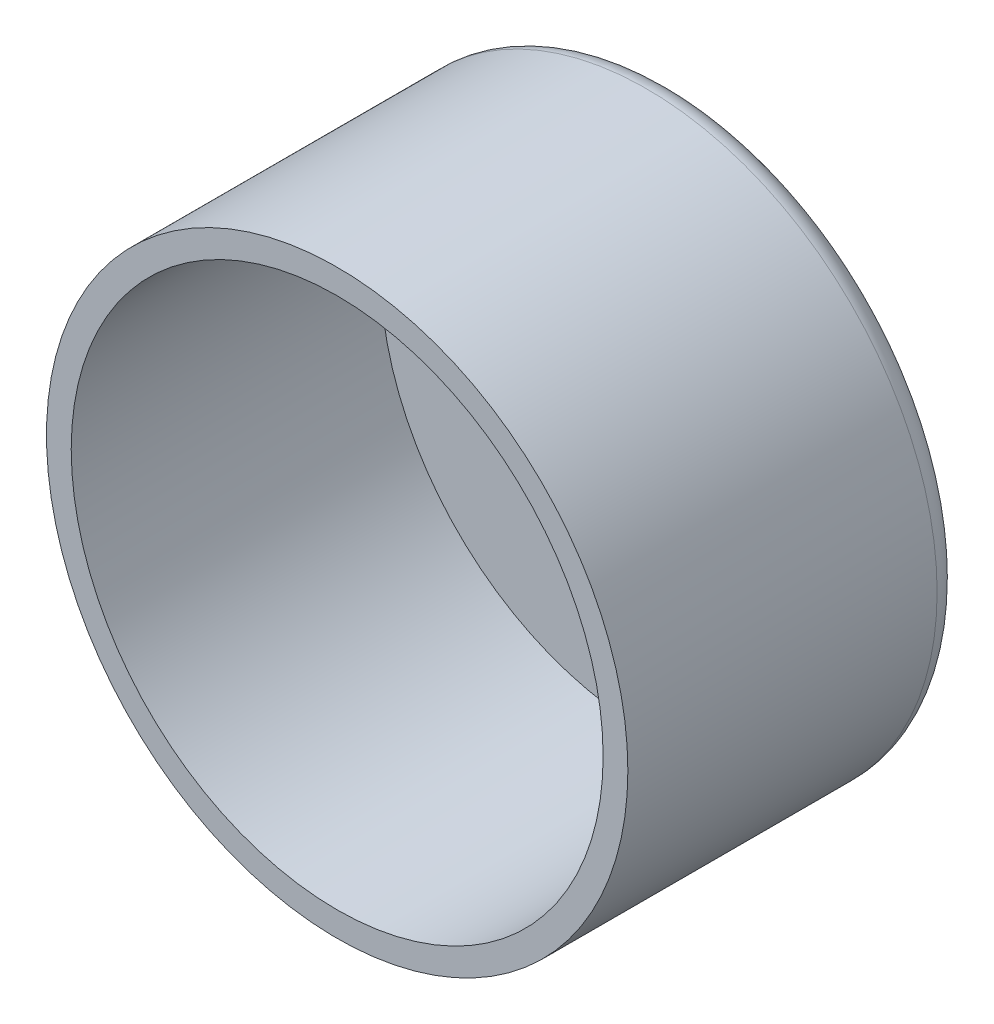
ISO-10303-21;
HEADER;
FILE_DESCRIPTION(('STEP AP214'),'2;1');
FILE_NAME('part.step','',(''),(''),'','','');
FILE_SCHEMA(('AUTOMOTIVE_DESIGN { 1 0 10303 214 1 1 1 1 }'));
ENDSEC;
DATA;
#1=APPLICATION_CONTEXT('core data for automotive mechanical design processes');
#2=APPLICATION_PROTOCOL_DEFINITION('international standard','automotive_design',2000,#1);
#3=PRODUCT_CONTEXT('',#1,'mechanical');
#4=PRODUCT('Part','Part','',(#3));
#5=PRODUCT_RELATED_PRODUCT_CATEGORY('part','',(#4));
#6=PRODUCT_DEFINITION_FORMATION('','',#4);
#7=PRODUCT_DEFINITION_CONTEXT('part definition',#1,'design');
#8=PRODUCT_DEFINITION('design','',#6,#7);
#9=PRODUCT_DEFINITION_SHAPE('','',#8);
#10=(LENGTH_UNIT() NAMED_UNIT(*) SI_UNIT(.MILLI.,.METRE.));
#11=(NAMED_UNIT(*) PLANE_ANGLE_UNIT() SI_UNIT($,.RADIAN.));
#12=(NAMED_UNIT(*) SI_UNIT($,.STERADIAN.) SOLID_ANGLE_UNIT());
#13=UNCERTAINTY_MEASURE_WITH_UNIT(LENGTH_MEASURE(1.E-05),#10,'distance_accuracy_value','');
#14=(GEOMETRIC_REPRESENTATION_CONTEXT(3) GLOBAL_UNCERTAINTY_ASSIGNED_CONTEXT((#13)) GLOBAL_UNIT_ASSIGNED_CONTEXT((#10,
#11,#12)) REPRESENTATION_CONTEXT('',''));
#15=CARTESIAN_POINT('',(0.,0.,0.));
#16=DIRECTION('',(0.,0.,1.));
#17=DIRECTION('',(1.,0.,0.));
#18=AXIS2_PLACEMENT_3D('',#15,#16,#17);
#19=CARTESIAN_POINT('',(0.,0.,27.));
#20=DIRECTION('',(0.,0.,-1.));
#21=DIRECTION('',(-1.,0.,0.));
#22=AXIS2_PLACEMENT_3D('',#19,#20,#21);
#23=CYLINDRICAL_SURFACE('',#22,23.5);
#24=CARTESIAN_POINT('',(0.,0.,2.));
#25=DIRECTION('',(0.,0.,1.));
#26=DIRECTION('',(1.,0.,0.));
#27=AXIS2_PLACEMENT_3D('',#24,#25,#26);
#28=CIRCLE('',#27,23.5);
#29=CARTESIAN_POINT('',(23.5,0.,2.));
#30=VERTEX_POINT('',#29);
#31=EDGE_CURVE('E51',#30,#30,#28,.T.);
#32=ORIENTED_EDGE('',*,*,#31,.T.);
#33=EDGE_LOOP('',(#32));
#34=FACE_BOUND('',#33,.T.);
#35=CARTESIAN_POINT('',(0.,0.,27.));
#36=DIRECTION('',(0.,0.,1.));
#37=DIRECTION('',(1.,0.,0.));
#38=AXIS2_PLACEMENT_3D('',#35,#36,#37);
#39=CIRCLE('',#38,23.5);
#40=CARTESIAN_POINT('',(23.5,0.,27.));
#41=VERTEX_POINT('',#40);
#42=EDGE_CURVE('E56',#41,#41,#39,.T.);
#43=ORIENTED_EDGE('',*,*,#42,.F.);
#44=EDGE_LOOP('',(#43));
#45=FACE_BOUND('',#44,.T.);
#46=ADVANCED_FACE('F43',(#34,#45),#23,.T.);
#47=CARTESIAN_POINT('',(0.,0.,27.));
#48=DIRECTION('',(0.,0.,1.));
#49=DIRECTION('',(1.,0.,0.));
#50=AXIS2_PLACEMENT_3D('',#47,#48,#49);
#51=PLANE('',#50);
#52=CARTESIAN_POINT('',(0.,0.,27.));
#53=DIRECTION('',(0.,0.,1.));
#54=DIRECTION('',(1.,0.,0.));
#55=AXIS2_PLACEMENT_3D('',#52,#53,#54);
#56=CIRCLE('',#55,21.5);
#57=CARTESIAN_POINT('',(21.5,0.,27.));
#58=VERTEX_POINT('',#57);
#59=EDGE_CURVE('E61',#58,#58,#56,.T.);
#60=ORIENTED_EDGE('',*,*,#59,.F.);
#61=EDGE_LOOP('',(#60));
#62=FACE_BOUND('',#61,.T.);
#63=ORIENTED_EDGE('',*,*,#42,.T.);
#64=EDGE_LOOP('',(#63));
#65=FACE_BOUND('',#64,.T.);
#66=ADVANCED_FACE('F85',(#62,#65),#51,.T.);
#67=CARTESIAN_POINT('',(0.,0.,0.));
#68=DIRECTION('',(0.,0.,1.));
#69=DIRECTION('',(1.,0.,0.));
#70=AXIS2_PLACEMENT_3D('',#67,#68,#69);
#71=PLANE('',#70);
#72=CARTESIAN_POINT('',(0.,0.,0.));
#73=DIRECTION('',(0.,0.,1.));
#74=DIRECTION('',(1.,0.,0.));
#75=AXIS2_PLACEMENT_3D('',#72,#73,#74);
#76=CIRCLE('',#75,21.5);
#77=CARTESIAN_POINT('',(21.5,0.,0.));
#78=VERTEX_POINT('',#77);
#79=EDGE_CURVE('E10',#78,#78,#76,.F.);
#80=ORIENTED_EDGE('',*,*,#79,.T.);
#81=EDGE_LOOP('',(#80));
#82=FACE_BOUND('',#81,.T.);
#83=ADVANCED_FACE('F76',(#82),#71,.F.);
#84=CARTESIAN_POINT('',(0.,0.,27.));
#85=DIRECTION('',(0.,0.,-1.));
#86=DIRECTION('',(-1.,0.,0.));
#87=AXIS2_PLACEMENT_3D('',#84,#85,#86);
#88=CYLINDRICAL_SURFACE('',#87,21.5);
#89=ORIENTED_EDGE('',*,*,#59,.T.);
#90=EDGE_LOOP('',(#89));
#91=FACE_BOUND('',#90,.T.);
#92=CARTESIAN_POINT('',(0.,0.,2.));
#93=DIRECTION('',(0.,0.,1.));
#94=DIRECTION('',(1.,0.,0.));
#95=AXIS2_PLACEMENT_3D('',#92,#93,#94);
#96=CIRCLE('',#95,21.5);
#97=CARTESIAN_POINT('',(21.5,0.,2.));
#98=VERTEX_POINT('',#97);
#99=EDGE_CURVE('E67',#98,#98,#96,.T.);
#100=ORIENTED_EDGE('',*,*,#99,.F.);
#101=EDGE_LOOP('',(#100));
#102=FACE_BOUND('',#101,.T.);
#103=ADVANCED_FACE('F74',(#91,#102),#88,.F.);
#104=CARTESIAN_POINT('',(0.,0.,2.));
#105=DIRECTION('',(0.,0.,1.));
#106=DIRECTION('',(1.,0.,0.));
#107=AXIS2_PLACEMENT_3D('',#104,#105,#106);
#108=PLANE('',#107);
#109=ORIENTED_EDGE('',*,*,#99,.T.);
#110=EDGE_LOOP('',(#109));
#111=FACE_BOUND('',#110,.T.);
#112=ADVANCED_FACE('F72',(#111),#108,.T.);
#113=CARTESIAN_POINT('',(0.,0.,2.));
#114=DIRECTION('',(0.,0.,1.));
#115=DIRECTION('',(1.,0.,0.));
#116=AXIS2_PLACEMENT_3D('',#113,#114,#115);
#117=TOROIDAL_SURFACE('',#116,21.5,2.);
#118=ORIENTED_EDGE('',*,*,#79,.F.);
#119=EDGE_LOOP('',(#118));
#120=FACE_BOUND('',#119,.T.);
#121=ORIENTED_EDGE('',*,*,#31,.F.);
#122=EDGE_LOOP('',(#121));
#123=FACE_BOUND('',#122,.T.);
#124=ADVANCED_FACE('F45',(#120,#123),#117,.T.);
#125=CLOSED_SHELL('',(#46,#66,#83,#103,#112,#124));
#126=MANIFOLD_SOLID_BREP('B2',#125);
#127=ADVANCED_BREP_SHAPE_REPRESENTATION('',(#18,#126),#14);
#128=SHAPE_DEFINITION_REPRESENTATION(#9,#127);
ENDSEC;
END-ISO-10303-21;
